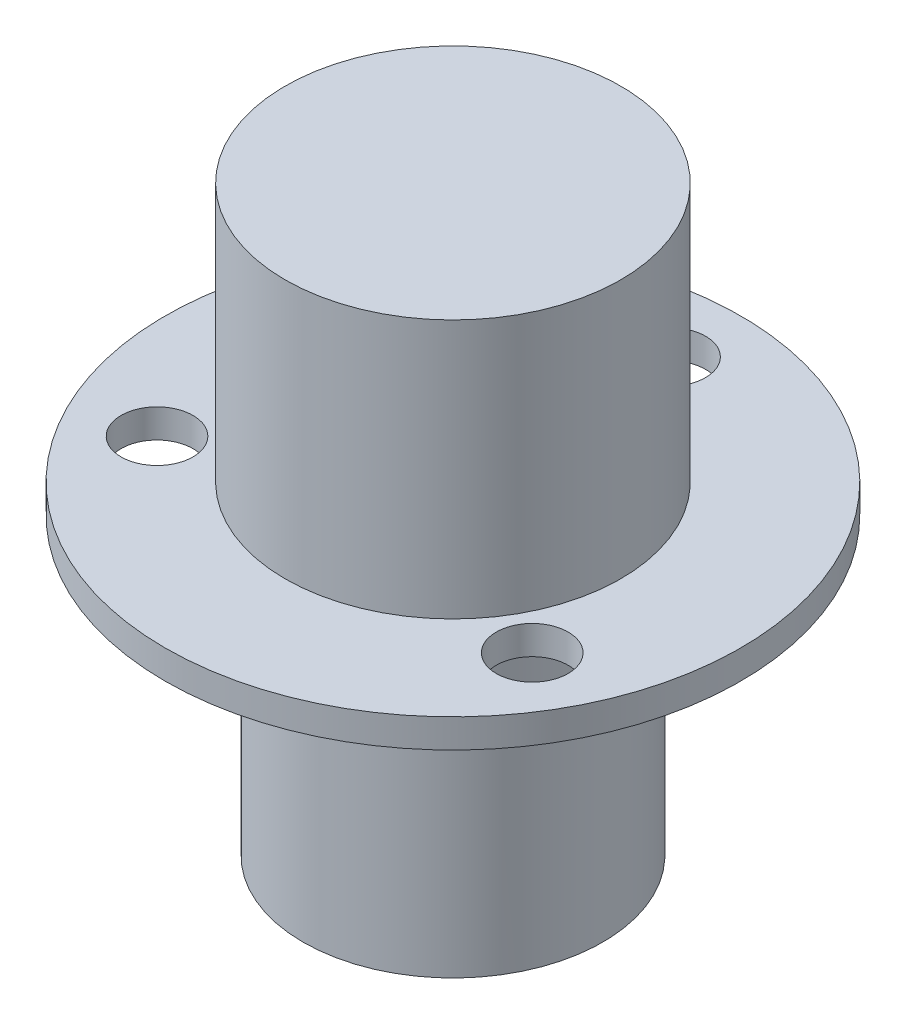
ISO-10303-21;
HEADER;
FILE_DESCRIPTION(('STEP AP214'),'2;1');
FILE_NAME('part.step','',(''),(''),'','','');
FILE_SCHEMA(('AUTOMOTIVE_DESIGN { 1 0 10303 214 1 1 1 1 }'));
ENDSEC;
DATA;
#1=APPLICATION_CONTEXT('core data for automotive mechanical design processes');
#2=APPLICATION_PROTOCOL_DEFINITION('international standard','automotive_design',2000,#1);
#3=PRODUCT_CONTEXT('',#1,'mechanical');
#4=PRODUCT('Part','Part','',(#3));
#5=PRODUCT_RELATED_PRODUCT_CATEGORY('part','',(#4));
#6=PRODUCT_DEFINITION_FORMATION('','',#4);
#7=PRODUCT_DEFINITION_CONTEXT('part definition',#1,'design');
#8=PRODUCT_DEFINITION('design','',#6,#7);
#9=PRODUCT_DEFINITION_SHAPE('','',#8);
#10=(LENGTH_UNIT() NAMED_UNIT(*) SI_UNIT(.MILLI.,.METRE.));
#11=(NAMED_UNIT(*) PLANE_ANGLE_UNIT() SI_UNIT($,.RADIAN.));
#12=(NAMED_UNIT(*) SI_UNIT($,.STERADIAN.) SOLID_ANGLE_UNIT());
#13=UNCERTAINTY_MEASURE_WITH_UNIT(LENGTH_MEASURE(1.E-05),#10,'distance_accuracy_value','');
#14=(GEOMETRIC_REPRESENTATION_CONTEXT(3) GLOBAL_UNCERTAINTY_ASSIGNED_CONTEXT((#13)) GLOBAL_UNIT_ASSIGNED_CONTEXT((#10,
#11,#12)) REPRESENTATION_CONTEXT('',''));
#15=CARTESIAN_POINT('',(0.,0.,0.));
#16=DIRECTION('',(0.,0.,1.));
#17=DIRECTION('',(1.,0.,0.));
#18=AXIS2_PLACEMENT_3D('',#15,#16,#17);
#19=CARTESIAN_POINT('',(0.,1.2,0.));
#20=DIRECTION('',(0.,1.,0.));
#21=DIRECTION('',(0.,0.,1.));
#22=AXIS2_PLACEMENT_3D('',#19,#20,#21);
#23=PLANE('',#22);
#24=CARTESIAN_POINT('',(0.,1.2,0.));
#25=DIRECTION('',(0.,1.,0.));
#26=DIRECTION('',(0.,0.,1.));
#27=AXIS2_PLACEMENT_3D('',#24,#25,#26);
#28=CIRCLE('',#27,7.);
#29=CARTESIAN_POINT('',(0.,1.2,7.));
#30=VERTEX_POINT('',#29);
#31=EDGE_CURVE('E69',#30,#30,#28,.F.);
#32=ORIENTED_EDGE('',*,*,#31,.T.);
#33=EDGE_LOOP('',(#32));
#34=FACE_BOUND('',#33,.T.);
#35=CARTESIAN_POINT('',(-7.82407967333507,1.2,4.51723450556106));
#36=DIRECTION('',(0.,1.,0.));
#37=DIRECTION('',(0.,0.,1.));
#38=AXIS2_PLACEMENT_3D('',#35,#36,#37);
#39=CIRCLE('',#38,1.5);
#40=CARTESIAN_POINT('',(-7.82407967333507,1.2,6.01723450556106));
#41=VERTEX_POINT('',#40);
#42=EDGE_CURVE('E61',#41,#41,#39,.T.);
#43=ORIENTED_EDGE('',*,*,#42,.F.);
#44=EDGE_LOOP('',(#43));
#45=FACE_BOUND('',#44,.T.);
#46=CARTESIAN_POINT('',(7.82407967333507,1.2,4.51723450556105));
#47=DIRECTION('',(0.,1.,0.));
#48=DIRECTION('',(0.,0.,1.));
#49=AXIS2_PLACEMENT_3D('',#46,#47,#48);
#50=CIRCLE('',#49,1.5);
#51=CARTESIAN_POINT('',(7.82407967333507,1.2,6.01723450556105));
#52=VERTEX_POINT('',#51);
#53=EDGE_CURVE('E55',#52,#52,#50,.T.);
#54=ORIENTED_EDGE('',*,*,#53,.F.);
#55=EDGE_LOOP('',(#54));
#56=FACE_BOUND('',#55,.T.);
#57=CARTESIAN_POINT('',(0.,1.2,-9.03446901112215));
#58=DIRECTION('',(0.,1.,0.));
#59=DIRECTION('',(0.,0.,1.));
#60=AXIS2_PLACEMENT_3D('',#57,#58,#59);
#61=CIRCLE('',#60,1.5);
#62=CARTESIAN_POINT('',(0.,1.2,-7.53446901112215));
#63=VERTEX_POINT('',#62);
#64=EDGE_CURVE('E49',#63,#63,#61,.T.);
#65=ORIENTED_EDGE('',*,*,#64,.F.);
#66=EDGE_LOOP('',(#65));
#67=FACE_BOUND('',#66,.T.);
#68=CARTESIAN_POINT('',(0.,1.2,0.));
#69=DIRECTION('',(0.,1.,0.));
#70=DIRECTION('',(0.,0.,1.));
#71=AXIS2_PLACEMENT_3D('',#68,#69,#70);
#72=CIRCLE('',#71,12.);
#73=CARTESIAN_POINT('',(0.,1.2,12.));
#74=VERTEX_POINT('',#73);
#75=EDGE_CURVE('E38',#74,#74,#72,.T.);
#76=ORIENTED_EDGE('',*,*,#75,.T.);
#77=EDGE_LOOP('',(#76));
#78=FACE_BOUND('',#77,.T.);
#79=ADVANCED_FACE('F31',(#34,#45,#56,#67,#78),#23,.T.);
#80=CARTESIAN_POINT('',(0.,0.,0.));
#81=DIRECTION('',(0.,1.,0.));
#82=DIRECTION('',(0.,0.,1.));
#83=AXIS2_PLACEMENT_3D('',#80,#81,#82);
#84=PLANE('',#83);
#85=CARTESIAN_POINT('',(-7.82407967333507,0.,4.51723450556106));
#86=DIRECTION('',(0.,1.,0.));
#87=DIRECTION('',(0.,0.,1.));
#88=AXIS2_PLACEMENT_3D('',#85,#86,#87);
#89=CIRCLE('',#88,1.5);
#90=CARTESIAN_POINT('',(-7.82407967333507,0.,6.01723450556106));
#91=VERTEX_POINT('',#90);
#92=EDGE_CURVE('E58',#91,#91,#89,.T.);
#93=ORIENTED_EDGE('',*,*,#92,.T.);
#94=EDGE_LOOP('',(#93));
#95=FACE_BOUND('',#94,.T.);
#96=CARTESIAN_POINT('',(7.82407967333507,0.,4.51723450556105));
#97=DIRECTION('',(0.,1.,0.));
#98=DIRECTION('',(0.,0.,1.));
#99=AXIS2_PLACEMENT_3D('',#96,#97,#98);
#100=CIRCLE('',#99,1.5);
#101=CARTESIAN_POINT('',(7.82407967333507,0.,6.01723450556105));
#102=VERTEX_POINT('',#101);
#103=EDGE_CURVE('E52',#102,#102,#100,.T.);
#104=ORIENTED_EDGE('',*,*,#103,.T.);
#105=EDGE_LOOP('',(#104));
#106=FACE_BOUND('',#105,.T.);
#107=CARTESIAN_POINT('',(0.,0.,-9.03446901112215));
#108=DIRECTION('',(0.,1.,0.));
#109=DIRECTION('',(0.,0.,1.));
#110=AXIS2_PLACEMENT_3D('',#107,#108,#109);
#111=CIRCLE('',#110,1.5);
#112=CARTESIAN_POINT('',(0.,0.,-7.53446901112215));
#113=VERTEX_POINT('',#112);
#114=EDGE_CURVE('E47',#113,#113,#111,.T.);
#115=ORIENTED_EDGE('',*,*,#114,.T.);
#116=EDGE_LOOP('',(#115));
#117=FACE_BOUND('',#116,.T.);
#118=CARTESIAN_POINT('',(0.,0.,0.));
#119=DIRECTION('',(0.,1.,0.));
#120=DIRECTION('',(0.,0.,1.));
#121=AXIS2_PLACEMENT_3D('',#118,#119,#120);
#122=CIRCLE('',#121,12.);
#123=CARTESIAN_POINT('',(0.,0.,12.));
#124=VERTEX_POINT('',#123);
#125=EDGE_CURVE('E42',#124,#124,#122,.T.);
#126=ORIENTED_EDGE('',*,*,#125,.F.);
#127=EDGE_LOOP('',(#126));
#128=FACE_BOUND('',#127,.T.);
#129=CARTESIAN_POINT('',(0.,0.,0.));
#130=DIRECTION('',(0.,1.,0.));
#131=DIRECTION('',(0.,0.,1.));
#132=AXIS2_PLACEMENT_3D('',#129,#130,#131);
#133=CIRCLE('',#132,6.25);
#134=CARTESIAN_POINT('',(0.,0.,6.25));
#135=VERTEX_POINT('',#134);
#136=EDGE_CURVE('E10',#135,#135,#133,.F.);
#137=ORIENTED_EDGE('',*,*,#136,.F.);
#138=EDGE_LOOP('',(#137));
#139=FACE_BOUND('',#138,.T.);
#140=ADVANCED_FACE('F93',(#95,#106,#117,#128,#139),#84,.F.);
#141=CARTESIAN_POINT('',(0.,1.2,0.));
#142=DIRECTION('',(0.,-1.,0.));
#143=DIRECTION('',(0.,0.,-1.));
#144=AXIS2_PLACEMENT_3D('',#141,#142,#143);
#145=CYLINDRICAL_SURFACE('',#144,12.);
#146=ORIENTED_EDGE('',*,*,#75,.F.);
#147=EDGE_LOOP('',(#146));
#148=FACE_BOUND('',#147,.T.);
#149=ORIENTED_EDGE('',*,*,#125,.T.);
#150=EDGE_LOOP('',(#149));
#151=FACE_BOUND('',#150,.T.);
#152=ADVANCED_FACE('F33',(#148,#151),#145,.T.);
#153=CARTESIAN_POINT('',(0.,0.,-9.03446901112215));
#154=DIRECTION('',(0.,1.,0.));
#155=DIRECTION('',(0.,0.,1.));
#156=AXIS2_PLACEMENT_3D('',#153,#154,#155);
#157=CYLINDRICAL_SURFACE('',#156,1.5);
#158=ORIENTED_EDGE('',*,*,#114,.F.);
#159=EDGE_LOOP('',(#158));
#160=FACE_BOUND('',#159,.T.);
#161=ORIENTED_EDGE('',*,*,#64,.T.);
#162=EDGE_LOOP('',(#161));
#163=FACE_BOUND('',#162,.T.);
#164=ADVANCED_FACE('F103',(#160,#163),#157,.F.);
#165=CARTESIAN_POINT('',(7.82407967333507,0.,4.51723450556105));
#166=DIRECTION('',(0.,1.,0.));
#167=DIRECTION('',(0.,0.,1.));
#168=AXIS2_PLACEMENT_3D('',#165,#166,#167);
#169=CYLINDRICAL_SURFACE('',#168,1.5);
#170=ORIENTED_EDGE('',*,*,#103,.F.);
#171=EDGE_LOOP('',(#170));
#172=FACE_BOUND('',#171,.T.);
#173=ORIENTED_EDGE('',*,*,#53,.T.);
#174=EDGE_LOOP('',(#173));
#175=FACE_BOUND('',#174,.T.);
#176=ADVANCED_FACE('F106',(#172,#175),#169,.F.);
#177=CARTESIAN_POINT('',(-7.82407967333507,0.,4.51723450556106));
#178=DIRECTION('',(0.,1.,0.));
#179=DIRECTION('',(0.,0.,1.));
#180=AXIS2_PLACEMENT_3D('',#177,#178,#179);
#181=CYLINDRICAL_SURFACE('',#180,1.5);
#182=ORIENTED_EDGE('',*,*,#92,.F.);
#183=EDGE_LOOP('',(#182));
#184=FACE_BOUND('',#183,.T.);
#185=ORIENTED_EDGE('',*,*,#42,.T.);
#186=EDGE_LOOP('',(#185));
#187=FACE_BOUND('',#186,.T.);
#188=ADVANCED_FACE('F110',(#184,#187),#181,.F.);
#189=CARTESIAN_POINT('',(0.,-12.3,0.));
#190=DIRECTION('',(0.,1.,0.));
#191=DIRECTION('',(0.,0.,1.));
#192=AXIS2_PLACEMENT_3D('',#189,#190,#191);
#193=CYLINDRICAL_SURFACE('',#192,6.25);
#194=CARTESIAN_POINT('',(0.,-12.3,0.));
#195=DIRECTION('',(0.,-1.,0.));
#196=DIRECTION('',(0.,0.,-1.));
#197=AXIS2_PLACEMENT_3D('',#194,#195,#196);
#198=CIRCLE('',#197,6.25);
#199=CARTESIAN_POINT('',(0.,-12.3,-6.25));
#200=VERTEX_POINT('',#199);
#201=EDGE_CURVE('E64',#200,#200,#198,.T.);
#202=ORIENTED_EDGE('',*,*,#201,.F.);
#203=EDGE_LOOP('',(#202));
#204=FACE_BOUND('',#203,.T.);
#205=ORIENTED_EDGE('',*,*,#136,.T.);
#206=EDGE_LOOP('',(#205));
#207=FACE_BOUND('',#206,.T.);
#208=ADVANCED_FACE('F88',(#204,#207),#193,.T.);
#209=CARTESIAN_POINT('',(0.,-12.3,0.));
#210=DIRECTION('',(0.,-1.,0.));
#211=DIRECTION('',(0.,0.,-1.));
#212=AXIS2_PLACEMENT_3D('',#209,#210,#211);
#213=PLANE('',#212);
#214=ORIENTED_EDGE('',*,*,#201,.T.);
#215=EDGE_LOOP('',(#214));
#216=FACE_BOUND('',#215,.T.);
#217=ADVANCED_FACE('F80',(#216),#213,.T.);
#218=CARTESIAN_POINT('',(0.,12.,0.));
#219=DIRECTION('',(0.,-1.,0.));
#220=DIRECTION('',(0.,0.,-1.));
#221=AXIS2_PLACEMENT_3D('',#218,#219,#220);
#222=CYLINDRICAL_SURFACE('',#221,7.);
#223=ORIENTED_EDGE('',*,*,#31,.F.);
#224=EDGE_LOOP('',(#223));
#225=FACE_BOUND('',#224,.T.);
#226=CARTESIAN_POINT('',(0.,12.,0.));
#227=DIRECTION('',(0.,1.,0.));
#228=DIRECTION('',(0.,0.,1.));
#229=AXIS2_PLACEMENT_3D('',#226,#227,#228);
#230=CIRCLE('',#229,7.);
#231=CARTESIAN_POINT('',(0.,12.,7.));
#232=VERTEX_POINT('',#231);
#233=EDGE_CURVE('E72',#232,#232,#230,.T.);
#234=ORIENTED_EDGE('',*,*,#233,.F.);
#235=EDGE_LOOP('',(#234));
#236=FACE_BOUND('',#235,.T.);
#237=ADVANCED_FACE('F78',(#225,#236),#222,.T.);
#238=CARTESIAN_POINT('',(0.,12.,0.));
#239=DIRECTION('',(0.,1.,0.));
#240=DIRECTION('',(0.,0.,1.));
#241=AXIS2_PLACEMENT_3D('',#238,#239,#240);
#242=PLANE('',#241);
#243=ORIENTED_EDGE('',*,*,#233,.T.);
#244=EDGE_LOOP('',(#243));
#245=FACE_BOUND('',#244,.T.);
#246=ADVANCED_FACE('F76',(#245),#242,.T.);
#247=CLOSED_SHELL('',(#79,#140,#152,#164,#176,#188,#208,#217,#237,#246));
#248=MANIFOLD_SOLID_BREP('B2',#247);
#249=ADVANCED_BREP_SHAPE_REPRESENTATION('',(#18,#248),#14);
#250=SHAPE_DEFINITION_REPRESENTATION(#9,#249);
ENDSEC;
END-ISO-10303-21;
